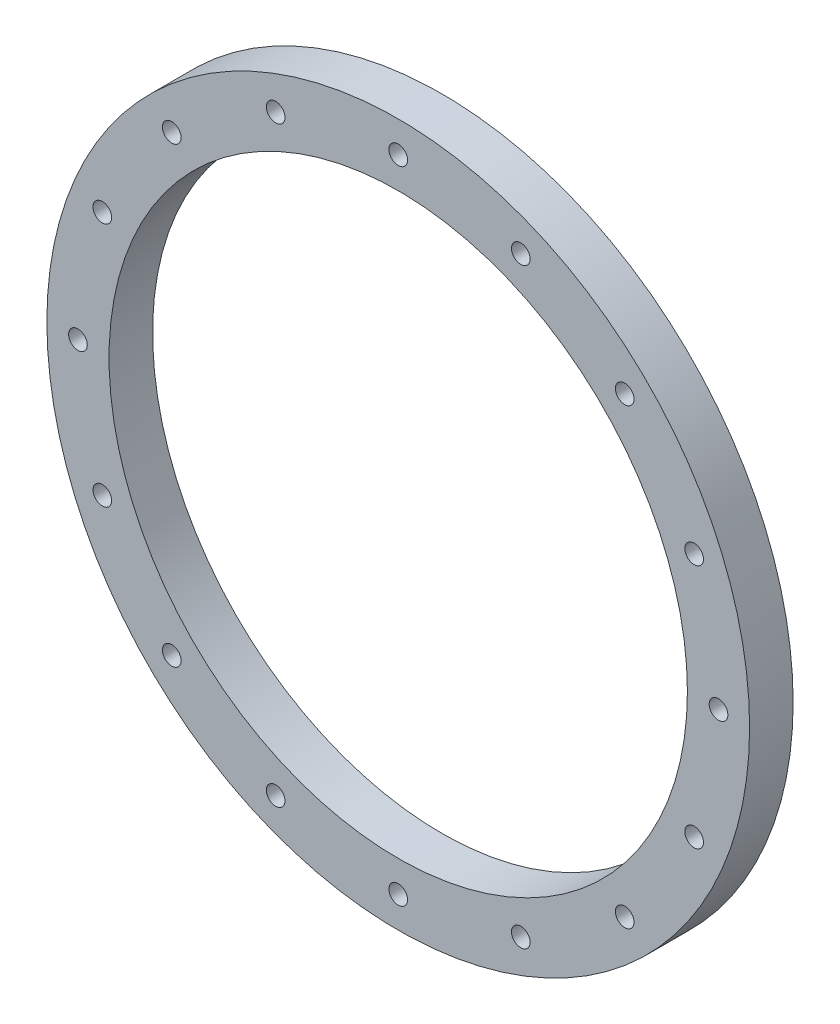
ISO-10303-21;
HEADER;
FILE_DESCRIPTION(('STEP AP214'),'2;1');
FILE_NAME('part.step','',(''),(''),'','','');
FILE_SCHEMA(('AUTOMOTIVE_DESIGN { 1 0 10303 214 1 1 1 1 }'));
ENDSEC;
DATA;
#1=APPLICATION_CONTEXT('core data for automotive mechanical design processes');
#2=APPLICATION_PROTOCOL_DEFINITION('international standard','automotive_design',2000,#1);
#3=PRODUCT_CONTEXT('',#1,'mechanical');
#4=PRODUCT('Part','Part','',(#3));
#5=PRODUCT_RELATED_PRODUCT_CATEGORY('part','',(#4));
#6=PRODUCT_DEFINITION_FORMATION('','',#4);
#7=PRODUCT_DEFINITION_CONTEXT('part definition',#1,'design');
#8=PRODUCT_DEFINITION('design','',#6,#7);
#9=PRODUCT_DEFINITION_SHAPE('','',#8);
#10=(LENGTH_UNIT() NAMED_UNIT(*) SI_UNIT(.MILLI.,.METRE.));
#11=(NAMED_UNIT(*) PLANE_ANGLE_UNIT() SI_UNIT($,.RADIAN.));
#12=(NAMED_UNIT(*) SI_UNIT($,.STERADIAN.) SOLID_ANGLE_UNIT());
#13=UNCERTAINTY_MEASURE_WITH_UNIT(LENGTH_MEASURE(1.E-05),#10,'distance_accuracy_value','');
#14=(GEOMETRIC_REPRESENTATION_CONTEXT(3) GLOBAL_UNCERTAINTY_ASSIGNED_CONTEXT((#13)) GLOBAL_UNIT_ASSIGNED_CONTEXT((#10,
#11,#12)) REPRESENTATION_CONTEXT('',''));
#15=CARTESIAN_POINT('',(0.,0.,0.));
#16=DIRECTION('',(0.,0.,1.));
#17=DIRECTION('',(1.,0.,0.));
#18=AXIS2_PLACEMENT_3D('',#15,#16,#17);
#19=CARTESIAN_POINT('',(0.,0.,70.));
#20=DIRECTION('',(0.,0.,1.));
#21=DIRECTION('',(1.,0.,0.));
#22=AXIS2_PLACEMENT_3D('',#19,#20,#21);
#23=PLANE('',#22);
#24=CARTESIAN_POINT('',(364.135243573728,364.135243573733,70.));
#25=DIRECTION('',(0.,0.,1.));
#26=DIRECTION('',(1.,0.,0.));
#27=AXIS2_PLACEMENT_3D('',#24,#25,#26);
#28=CIRCLE('',#27,15.);
#29=CARTESIAN_POINT('',(379.135243573728,364.135243573733,70.));
#30=VERTEX_POINT('',#29);
#31=EDGE_CURVE('E47',#30,#30,#28,.T.);
#32=ORIENTED_EDGE('',*,*,#31,.F.);
#33=EDGE_LOOP('',(#32));
#34=FACE_BOUND('',#33,.T.);
#35=CARTESIAN_POINT('',(475.765623459674,197.068573747892,70.));
#36=DIRECTION('',(0.,0.,1.));
#37=DIRECTION('',(1.,0.,0.));
#38=AXIS2_PLACEMENT_3D('',#35,#36,#37);
#39=CIRCLE('',#38,15.);
#40=CARTESIAN_POINT('',(490.765623459674,197.068573747892,70.));
#41=VERTEX_POINT('',#40);
#42=EDGE_CURVE('E52',#41,#41,#39,.T.);
#43=ORIENTED_EDGE('',*,*,#42,.F.);
#44=EDGE_LOOP('',(#43));
#45=FACE_BOUND('',#44,.T.);
#46=CARTESIAN_POINT('',(514.965,3.32003508423193E-12,70.));
#47=DIRECTION('',(0.,0.,1.));
#48=DIRECTION('',(1.,0.,0.));
#49=AXIS2_PLACEMENT_3D('',#46,#47,#48);
#50=CIRCLE('',#49,15.0000000000001);
#51=CARTESIAN_POINT('',(529.965,3.32003508423193E-12,70.));
#52=VERTEX_POINT('',#51);
#53=EDGE_CURVE('E55',#52,#52,#50,.T.);
#54=ORIENTED_EDGE('',*,*,#53,.F.);
#55=EDGE_LOOP('',(#54));
#56=FACE_BOUND('',#55,.T.);
#57=CARTESIAN_POINT('',(475.765623459676,-197.068573747885,70.));
#58=DIRECTION('',(0.,0.,1.));
#59=DIRECTION('',(1.,0.,0.));
#60=AXIS2_PLACEMENT_3D('',#57,#58,#59);
#61=CIRCLE('',#60,15.);
#62=CARTESIAN_POINT('',(490.765623459676,-197.068573747885,70.));
#63=VERTEX_POINT('',#62);
#64=EDGE_CURVE('E58',#63,#63,#61,.T.);
#65=ORIENTED_EDGE('',*,*,#64,.F.);
#66=EDGE_LOOP('',(#65));
#67=FACE_BOUND('',#66,.T.);
#68=CARTESIAN_POINT('',(364.135243573733,-364.135243573728,70.));
#69=DIRECTION('',(0.,0.,1.));
#70=DIRECTION('',(1.,0.,0.));
#71=AXIS2_PLACEMENT_3D('',#68,#69,#70);
#72=CIRCLE('',#71,15.0000000000001);
#73=CARTESIAN_POINT('',(379.135243573733,-364.135243573728,70.));
#74=VERTEX_POINT('',#73);
#75=EDGE_CURVE('E61',#74,#74,#72,.T.);
#76=ORIENTED_EDGE('',*,*,#75,.F.);
#77=EDGE_LOOP('',(#76));
#78=FACE_BOUND('',#77,.T.);
#79=CARTESIAN_POINT('',(197.068573747892,-475.765623459674,70.));
#80=DIRECTION('',(0.,0.,1.));
#81=DIRECTION('',(1.,0.,0.));
#82=AXIS2_PLACEMENT_3D('',#79,#80,#81);
#83=CIRCLE('',#82,15.);
#84=CARTESIAN_POINT('',(212.068573747892,-475.765623459674,70.));
#85=VERTEX_POINT('',#84);
#86=EDGE_CURVE('E64',#85,#85,#83,.T.);
#87=ORIENTED_EDGE('',*,*,#86,.F.);
#88=EDGE_LOOP('',(#87));
#89=FACE_BOUND('',#88,.T.);
#90=CARTESIAN_POINT('',(3.34454686168328E-12,-514.965,70.));
#91=DIRECTION('',(0.,0.,1.));
#92=DIRECTION('',(1.,0.,0.));
#93=AXIS2_PLACEMENT_3D('',#90,#91,#92);
#94=CIRCLE('',#93,15.);
#95=CARTESIAN_POINT('',(15.0000000000034,-514.965,70.));
#96=VERTEX_POINT('',#95);
#97=EDGE_CURVE('E67',#96,#96,#94,.T.);
#98=ORIENTED_EDGE('',*,*,#97,.F.);
#99=EDGE_LOOP('',(#98));
#100=FACE_BOUND('',#99,.T.);
#101=CARTESIAN_POINT('',(-197.068573747885,-475.765623459676,70.));
#102=DIRECTION('',(0.,0.,1.));
#103=DIRECTION('',(1.,0.,0.));
#104=AXIS2_PLACEMENT_3D('',#101,#102,#103);
#105=CIRCLE('',#104,15.);
#106=CARTESIAN_POINT('',(-182.068573747885,-475.765623459676,70.));
#107=VERTEX_POINT('',#106);
#108=EDGE_CURVE('E70',#107,#107,#105,.T.);
#109=ORIENTED_EDGE('',*,*,#108,.F.);
#110=EDGE_LOOP('',(#109));
#111=FACE_BOUND('',#110,.T.);
#112=CARTESIAN_POINT('',(-364.135243573728,-364.135243573733,70.));
#113=DIRECTION('',(0.,0.,1.));
#114=DIRECTION('',(1.,0.,0.));
#115=AXIS2_PLACEMENT_3D('',#112,#113,#114);
#116=CIRCLE('',#115,15.);
#117=CARTESIAN_POINT('',(-349.135243573728,-364.135243573733,70.));
#118=VERTEX_POINT('',#117);
#119=EDGE_CURVE('E73',#118,#118,#116,.T.);
#120=ORIENTED_EDGE('',*,*,#119,.F.);
#121=EDGE_LOOP('',(#120));
#122=FACE_BOUND('',#121,.T.);
#123=CARTESIAN_POINT('',(-475.765623459674,-197.068573747892,70.));
#124=DIRECTION('',(0.,0.,1.));
#125=DIRECTION('',(1.,0.,0.));
#126=AXIS2_PLACEMENT_3D('',#123,#124,#125);
#127=CIRCLE('',#126,15.);
#128=CARTESIAN_POINT('',(-460.765623459673,-197.068573747892,70.));
#129=VERTEX_POINT('',#128);
#130=EDGE_CURVE('E76',#129,#129,#127,.T.);
#131=ORIENTED_EDGE('',*,*,#130,.F.);
#132=EDGE_LOOP('',(#131));
#133=FACE_BOUND('',#132,.T.);
#134=CARTESIAN_POINT('',(-514.965,-3.62904151174348E-12,70.));
#135=DIRECTION('',(0.,0.,1.));
#136=DIRECTION('',(1.,0.,0.));
#137=AXIS2_PLACEMENT_3D('',#134,#135,#136);
#138=CIRCLE('',#137,15.);
#139=CARTESIAN_POINT('',(-499.965,-3.62904151174348E-12,70.));
#140=VERTEX_POINT('',#139);
#141=EDGE_CURVE('E79',#140,#140,#138,.T.);
#142=ORIENTED_EDGE('',*,*,#141,.F.);
#143=EDGE_LOOP('',(#142));
#144=FACE_BOUND('',#143,.T.);
#145=CARTESIAN_POINT('',(-475.765623459676,197.068573747885,70.));
#146=DIRECTION('',(0.,0.,1.));
#147=DIRECTION('',(1.,0.,0.));
#148=AXIS2_PLACEMENT_3D('',#145,#146,#147);
#149=CIRCLE('',#148,15.);
#150=CARTESIAN_POINT('',(-460.765623459676,197.068573747885,70.));
#151=VERTEX_POINT('',#150);
#152=EDGE_CURVE('E82',#151,#151,#149,.T.);
#153=ORIENTED_EDGE('',*,*,#152,.F.);
#154=EDGE_LOOP('',(#153));
#155=FACE_BOUND('',#154,.T.);
#156=CARTESIAN_POINT('',(-364.135243573733,364.135243573728,70.));
#157=DIRECTION('',(0.,0.,1.));
#158=DIRECTION('',(1.,0.,0.));
#159=AXIS2_PLACEMENT_3D('',#156,#157,#158);
#160=CIRCLE('',#159,15.0000000000001);
#161=CARTESIAN_POINT('',(-349.135243573733,364.135243573728,70.));
#162=VERTEX_POINT('',#161);
#163=EDGE_CURVE('E85',#162,#162,#160,.T.);
#164=ORIENTED_EDGE('',*,*,#163,.F.);
#165=EDGE_LOOP('',(#164));
#166=FACE_BOUND('',#165,.T.);
#167=CARTESIAN_POINT('',(-197.068573747892,475.765623459674,70.));
#168=DIRECTION('',(0.,0.,1.));
#169=DIRECTION('',(1.,0.,0.));
#170=AXIS2_PLACEMENT_3D('',#167,#168,#169);
#171=CIRCLE('',#170,15.);
#172=CARTESIAN_POINT('',(-182.068573747892,475.765623459674,70.));
#173=VERTEX_POINT('',#172);
#174=EDGE_CURVE('E88',#173,#173,#171,.T.);
#175=ORIENTED_EDGE('',*,*,#174,.F.);
#176=EDGE_LOOP('',(#175));
#177=FACE_BOUND('',#176,.T.);
#178=CARTESIAN_POINT('',(-3.18495230189342E-12,514.965,70.));
#179=DIRECTION('',(0.,0.,1.));
#180=DIRECTION('',(1.,0.,0.));
#181=AXIS2_PLACEMENT_3D('',#178,#179,#180);
#182=CIRCLE('',#181,15.);
#183=CARTESIAN_POINT('',(14.9999999999968,514.965,70.));
#184=VERTEX_POINT('',#183);
#185=EDGE_CURVE('E91',#184,#184,#182,.T.);
#186=ORIENTED_EDGE('',*,*,#185,.F.);
#187=EDGE_LOOP('',(#186));
#188=FACE_BOUND('',#187,.T.);
#189=CARTESIAN_POINT('',(197.068573747885,475.765623459676,70.));
#190=DIRECTION('',(0.,0.,1.));
#191=DIRECTION('',(1.,0.,0.));
#192=AXIS2_PLACEMENT_3D('',#189,#190,#191);
#193=CIRCLE('',#192,15.0000000000001);
#194=CARTESIAN_POINT('',(212.068573747885,475.765623459676,70.));
#195=VERTEX_POINT('',#194);
#196=EDGE_CURVE('E94',#195,#195,#193,.T.);
#197=ORIENTED_EDGE('',*,*,#196,.F.);
#198=EDGE_LOOP('',(#197));
#199=FACE_BOUND('',#198,.T.);
#200=CARTESIAN_POINT('',(0.,0.,70.));
#201=DIRECTION('',(0.,0.,1.));
#202=DIRECTION('',(1.,0.,0.));
#203=AXIS2_PLACEMENT_3D('',#200,#201,#202);
#204=CIRCLE('',#203,564.965);
#205=CARTESIAN_POINT('',(564.965,0.,70.));
#206=VERTEX_POINT('',#205);
#207=EDGE_CURVE('E10',#206,#206,#204,.T.);
#208=ORIENTED_EDGE('',*,*,#207,.T.);
#209=EDGE_LOOP('',(#208));
#210=FACE_BOUND('',#209,.T.);
#211=CARTESIAN_POINT('',(0.,0.,70.));
#212=DIRECTION('',(0.,0.,1.));
#213=DIRECTION('',(1.,0.,0.));
#214=AXIS2_PLACEMENT_3D('',#211,#212,#213);
#215=CIRCLE('',#214,464.965);
#216=CARTESIAN_POINT('',(464.965,0.,70.));
#217=VERTEX_POINT('',#216);
#218=EDGE_CURVE('E42',#217,#217,#215,.T.);
#219=ORIENTED_EDGE('',*,*,#218,.F.);
#220=EDGE_LOOP('',(#219));
#221=FACE_BOUND('',#220,.T.);
#222=ADVANCED_FACE('F31',(#34,#45,#56,#67,#78,#89,#100,#111,#122,#133,#144,#155,#166,#177,#188,
#199,#210,#221),#23,.T.);
#223=CARTESIAN_POINT('',(0.,0.,0.));
#224=DIRECTION('',(0.,0.,1.));
#225=DIRECTION('',(1.,0.,0.));
#226=AXIS2_PLACEMENT_3D('',#223,#224,#225);
#227=PLANE('',#226);
#228=CARTESIAN_POINT('',(364.135243573728,364.135243573733,0.));
#229=DIRECTION('',(0.,0.,1.));
#230=DIRECTION('',(1.,0.,0.));
#231=AXIS2_PLACEMENT_3D('',#228,#229,#230);
#232=CIRCLE('',#231,15.);
#233=CARTESIAN_POINT('',(379.135243573728,364.135243573733,0.));
#234=VERTEX_POINT('',#233);
#235=EDGE_CURVE('E100',#234,#234,#232,.T.);
#236=ORIENTED_EDGE('',*,*,#235,.T.);
#237=EDGE_LOOP('',(#236));
#238=FACE_BOUND('',#237,.T.);
#239=CARTESIAN_POINT('',(475.765623459674,197.068573747892,0.));
#240=DIRECTION('',(0.,0.,1.));
#241=DIRECTION('',(1.,0.,0.));
#242=AXIS2_PLACEMENT_3D('',#239,#240,#241);
#243=CIRCLE('',#242,15.);
#244=CARTESIAN_POINT('',(490.765623459674,197.068573747892,0.));
#245=VERTEX_POINT('',#244);
#246=EDGE_CURVE('E120',#245,#245,#243,.T.);
#247=ORIENTED_EDGE('',*,*,#246,.T.);
#248=EDGE_LOOP('',(#247));
#249=FACE_BOUND('',#248,.T.);
#250=CARTESIAN_POINT('',(514.965,3.32003508423193E-12,0.));
#251=DIRECTION('',(0.,0.,1.));
#252=DIRECTION('',(1.,0.,0.));
#253=AXIS2_PLACEMENT_3D('',#250,#251,#252);
#254=CIRCLE('',#253,15.0000000000001);
#255=CARTESIAN_POINT('',(529.965,3.32003508423193E-12,0.));
#256=VERTEX_POINT('',#255);
#257=EDGE_CURVE('E117',#256,#256,#254,.T.);
#258=ORIENTED_EDGE('',*,*,#257,.T.);
#259=EDGE_LOOP('',(#258));
#260=FACE_BOUND('',#259,.T.);
#261=CARTESIAN_POINT('',(475.765623459676,-197.068573747885,0.));
#262=DIRECTION('',(0.,0.,1.));
#263=DIRECTION('',(1.,0.,0.));
#264=AXIS2_PLACEMENT_3D('',#261,#262,#263);
#265=CIRCLE('',#264,15.);
#266=CARTESIAN_POINT('',(490.765623459676,-197.068573747885,0.));
#267=VERTEX_POINT('',#266);
#268=EDGE_CURVE('E114',#267,#267,#265,.T.);
#269=ORIENTED_EDGE('',*,*,#268,.T.);
#270=EDGE_LOOP('',(#269));
#271=FACE_BOUND('',#270,.T.);
#272=CARTESIAN_POINT('',(364.135243573733,-364.135243573728,0.));
#273=DIRECTION('',(0.,0.,1.));
#274=DIRECTION('',(1.,0.,0.));
#275=AXIS2_PLACEMENT_3D('',#272,#273,#274);
#276=CIRCLE('',#275,15.0000000000001);
#277=CARTESIAN_POINT('',(379.135243573733,-364.135243573728,0.));
#278=VERTEX_POINT('',#277);
#279=EDGE_CURVE('E111',#278,#278,#276,.T.);
#280=ORIENTED_EDGE('',*,*,#279,.T.);
#281=EDGE_LOOP('',(#280));
#282=FACE_BOUND('',#281,.T.);
#283=CARTESIAN_POINT('',(197.068573747892,-475.765623459674,0.));
#284=DIRECTION('',(0.,0.,1.));
#285=DIRECTION('',(1.,0.,0.));
#286=AXIS2_PLACEMENT_3D('',#283,#284,#285);
#287=CIRCLE('',#286,15.);
#288=CARTESIAN_POINT('',(212.068573747892,-475.765623459674,0.));
#289=VERTEX_POINT('',#288);
#290=EDGE_CURVE('E108',#289,#289,#287,.T.);
#291=ORIENTED_EDGE('',*,*,#290,.T.);
#292=EDGE_LOOP('',(#291));
#293=FACE_BOUND('',#292,.T.);
#294=CARTESIAN_POINT('',(3.34454686168328E-12,-514.965,0.));
#295=DIRECTION('',(0.,0.,1.));
#296=DIRECTION('',(1.,0.,0.));
#297=AXIS2_PLACEMENT_3D('',#294,#295,#296);
#298=CIRCLE('',#297,15.);
#299=CARTESIAN_POINT('',(15.0000000000034,-514.965,0.));
#300=VERTEX_POINT('',#299);
#301=EDGE_CURVE('E104',#300,#300,#298,.T.);
#302=ORIENTED_EDGE('',*,*,#301,.T.);
#303=EDGE_LOOP('',(#302));
#304=FACE_BOUND('',#303,.T.);
#305=CARTESIAN_POINT('',(-197.068573747885,-475.765623459676,0.));
#306=DIRECTION('',(0.,0.,1.));
#307=DIRECTION('',(1.,0.,0.));
#308=AXIS2_PLACEMENT_3D('',#305,#306,#307);
#309=CIRCLE('',#308,15.);
#310=CARTESIAN_POINT('',(-182.068573747885,-475.765623459676,0.));
#311=VERTEX_POINT('',#310);
#312=EDGE_CURVE('E101',#311,#311,#309,.T.);
#313=ORIENTED_EDGE('',*,*,#312,.T.);
#314=EDGE_LOOP('',(#313));
#315=FACE_BOUND('',#314,.T.);
#316=CARTESIAN_POINT('',(-364.135243573728,-364.135243573733,0.));
#317=DIRECTION('',(0.,0.,1.));
#318=DIRECTION('',(1.,0.,0.));
#319=AXIS2_PLACEMENT_3D('',#316,#317,#318);
#320=CIRCLE('',#319,15.);
#321=CARTESIAN_POINT('',(-349.135243573728,-364.135243573733,0.));
#322=VERTEX_POINT('',#321);
#323=EDGE_CURVE('E105',#322,#322,#320,.T.);
#324=ORIENTED_EDGE('',*,*,#323,.T.);
#325=EDGE_LOOP('',(#324));
#326=FACE_BOUND('',#325,.T.);
#327=CARTESIAN_POINT('',(-475.765623459674,-197.068573747892,0.));
#328=DIRECTION('',(0.,0.,1.));
#329=DIRECTION('',(1.,0.,0.));
#330=AXIS2_PLACEMENT_3D('',#327,#328,#329);
#331=CIRCLE('',#330,15.);
#332=CARTESIAN_POINT('',(-460.765623459673,-197.068573747892,0.));
#333=VERTEX_POINT('',#332);
#334=EDGE_CURVE('E140',#333,#333,#331,.T.);
#335=ORIENTED_EDGE('',*,*,#334,.T.);
#336=EDGE_LOOP('',(#335));
#337=FACE_BOUND('',#336,.T.);
#338=CARTESIAN_POINT('',(-514.965,-3.62904151174348E-12,0.));
#339=DIRECTION('',(0.,0.,1.));
#340=DIRECTION('',(1.,0.,0.));
#341=AXIS2_PLACEMENT_3D('',#338,#339,#340);
#342=CIRCLE('',#341,15.);
#343=CARTESIAN_POINT('',(-499.965,-3.62904151174348E-12,0.));
#344=VERTEX_POINT('',#343);
#345=EDGE_CURVE('E137',#344,#344,#342,.T.);
#346=ORIENTED_EDGE('',*,*,#345,.T.);
#347=EDGE_LOOP('',(#346));
#348=FACE_BOUND('',#347,.T.);
#349=CARTESIAN_POINT('',(-475.765623459676,197.068573747885,0.));
#350=DIRECTION('',(0.,0.,1.));
#351=DIRECTION('',(1.,0.,0.));
#352=AXIS2_PLACEMENT_3D('',#349,#350,#351);
#353=CIRCLE('',#352,15.);
#354=CARTESIAN_POINT('',(-460.765623459676,197.068573747885,0.));
#355=VERTEX_POINT('',#354);
#356=EDGE_CURVE('E134',#355,#355,#353,.T.);
#357=ORIENTED_EDGE('',*,*,#356,.T.);
#358=EDGE_LOOP('',(#357));
#359=FACE_BOUND('',#358,.T.);
#360=CARTESIAN_POINT('',(-364.135243573733,364.135243573728,0.));
#361=DIRECTION('',(0.,0.,1.));
#362=DIRECTION('',(1.,0.,0.));
#363=AXIS2_PLACEMENT_3D('',#360,#361,#362);
#364=CIRCLE('',#363,15.0000000000001);
#365=CARTESIAN_POINT('',(-349.135243573733,364.135243573728,0.));
#366=VERTEX_POINT('',#365);
#367=EDGE_CURVE('E131',#366,#366,#364,.T.);
#368=ORIENTED_EDGE('',*,*,#367,.T.);
#369=EDGE_LOOP('',(#368));
#370=FACE_BOUND('',#369,.T.);
#371=CARTESIAN_POINT('',(-197.068573747892,475.765623459674,0.));
#372=DIRECTION('',(0.,0.,1.));
#373=DIRECTION('',(1.,0.,0.));
#374=AXIS2_PLACEMENT_3D('',#371,#372,#373);
#375=CIRCLE('',#374,15.);
#376=CARTESIAN_POINT('',(-182.068573747892,475.765623459674,0.));
#377=VERTEX_POINT('',#376);
#378=EDGE_CURVE('E128',#377,#377,#375,.T.);
#379=ORIENTED_EDGE('',*,*,#378,.T.);
#380=EDGE_LOOP('',(#379));
#381=FACE_BOUND('',#380,.T.);
#382=CARTESIAN_POINT('',(-3.18495230189342E-12,514.965,0.));
#383=DIRECTION('',(0.,0.,1.));
#384=DIRECTION('',(1.,0.,0.));
#385=AXIS2_PLACEMENT_3D('',#382,#383,#384);
#386=CIRCLE('',#385,15.);
#387=CARTESIAN_POINT('',(14.9999999999968,514.965,0.));
#388=VERTEX_POINT('',#387);
#389=EDGE_CURVE('E125',#388,#388,#386,.T.);
#390=ORIENTED_EDGE('',*,*,#389,.T.);
#391=EDGE_LOOP('',(#390));
#392=FACE_BOUND('',#391,.T.);
#393=CARTESIAN_POINT('',(197.068573747885,475.765623459676,0.));
#394=DIRECTION('',(0.,0.,1.));
#395=DIRECTION('',(1.,0.,0.));
#396=AXIS2_PLACEMENT_3D('',#393,#394,#395);
#397=CIRCLE('',#396,15.0000000000001);
#398=CARTESIAN_POINT('',(212.068573747885,475.765623459676,0.));
#399=VERTEX_POINT('',#398);
#400=EDGE_CURVE('E97',#399,#399,#397,.T.);
#401=ORIENTED_EDGE('',*,*,#400,.T.);
#402=EDGE_LOOP('',(#401));
#403=FACE_BOUND('',#402,.T.);
#404=CARTESIAN_POINT('',(0.,0.,0.));
#405=DIRECTION('',(0.,0.,1.));
#406=DIRECTION('',(1.,0.,0.));
#407=AXIS2_PLACEMENT_3D('',#404,#405,#406);
#408=CIRCLE('',#407,564.965);
#409=CARTESIAN_POINT('',(564.965,0.,0.));
#410=VERTEX_POINT('',#409);
#411=EDGE_CURVE('E35',#410,#410,#408,.T.);
#412=ORIENTED_EDGE('',*,*,#411,.F.);
#413=EDGE_LOOP('',(#412));
#414=FACE_BOUND('',#413,.T.);
#415=CARTESIAN_POINT('',(0.,0.,0.));
#416=DIRECTION('',(0.,0.,1.));
#417=DIRECTION('',(1.,0.,0.));
#418=AXIS2_PLACEMENT_3D('',#415,#416,#417);
#419=CIRCLE('',#418,464.965);
#420=CARTESIAN_POINT('',(464.965,0.,0.));
#421=VERTEX_POINT('',#420);
#422=EDGE_CURVE('E44',#421,#421,#419,.T.);
#423=ORIENTED_EDGE('',*,*,#422,.T.);
#424=EDGE_LOOP('',(#423));
#425=FACE_BOUND('',#424,.T.);
#426=ADVANCED_FACE('F146',(#238,#249,#260,#271,#282,#293,#304,#315,#326,#337,#348,#359,#370,
#381,#392,#403,#414,#425),#227,.F.);
#427=CARTESIAN_POINT('',(0.,0.,70.));
#428=DIRECTION('',(0.,0.,-1.));
#429=DIRECTION('',(-1.,0.,0.));
#430=AXIS2_PLACEMENT_3D('',#427,#428,#429);
#431=CYLINDRICAL_SURFACE('',#430,564.965);
#432=ORIENTED_EDGE('',*,*,#207,.F.);
#433=EDGE_LOOP('',(#432));
#434=FACE_BOUND('',#433,.T.);
#435=ORIENTED_EDGE('',*,*,#411,.T.);
#436=EDGE_LOOP('',(#435));
#437=FACE_BOUND('',#436,.T.);
#438=ADVANCED_FACE('F33',(#434,#437),#431,.T.);
#439=CARTESIAN_POINT('',(0.,0.,70.));
#440=DIRECTION('',(0.,0.,-1.));
#441=DIRECTION('',(-1.,0.,0.));
#442=AXIS2_PLACEMENT_3D('',#439,#440,#441);
#443=CYLINDRICAL_SURFACE('',#442,464.965);
#444=ORIENTED_EDGE('',*,*,#218,.T.);
#445=EDGE_LOOP('',(#444));
#446=FACE_BOUND('',#445,.T.);
#447=ORIENTED_EDGE('',*,*,#422,.F.);
#448=EDGE_LOOP('',(#447));
#449=FACE_BOUND('',#448,.T.);
#450=ADVANCED_FACE('F175',(#446,#449),#443,.F.);
#451=CARTESIAN_POINT('',(197.068573747885,475.765623459676,0.));
#452=DIRECTION('',(0.,0.,1.));
#453=DIRECTION('',(1.,0.,0.));
#454=AXIS2_PLACEMENT_3D('',#451,#452,#453);
#455=CYLINDRICAL_SURFACE('',#454,15.0000000000001);
#456=ORIENTED_EDGE('',*,*,#196,.T.);
#457=EDGE_LOOP('',(#456));
#458=FACE_BOUND('',#457,.T.);
#459=ORIENTED_EDGE('',*,*,#400,.F.);
#460=EDGE_LOOP('',(#459));
#461=FACE_BOUND('',#460,.T.);
#462=ADVANCED_FACE('F178',(#458,#461),#455,.F.);
#463=CARTESIAN_POINT('',(-3.18495230189342E-12,514.965,0.));
#464=DIRECTION('',(0.,0.,1.));
#465=DIRECTION('',(1.,0.,0.));
#466=AXIS2_PLACEMENT_3D('',#463,#464,#465);
#467=CYLINDRICAL_SURFACE('',#466,15.);
#468=ORIENTED_EDGE('',*,*,#185,.T.);
#469=EDGE_LOOP('',(#468));
#470=FACE_BOUND('',#469,.T.);
#471=ORIENTED_EDGE('',*,*,#389,.F.);
#472=EDGE_LOOP('',(#471));
#473=FACE_BOUND('',#472,.T.);
#474=ADVANCED_FACE('F181',(#470,#473),#467,.F.);
#475=CARTESIAN_POINT('',(-197.068573747892,475.765623459674,0.));
#476=DIRECTION('',(0.,0.,1.));
#477=DIRECTION('',(1.,0.,0.));
#478=AXIS2_PLACEMENT_3D('',#475,#476,#477);
#479=CYLINDRICAL_SURFACE('',#478,15.);
#480=ORIENTED_EDGE('',*,*,#174,.T.);
#481=EDGE_LOOP('',(#480));
#482=FACE_BOUND('',#481,.T.);
#483=ORIENTED_EDGE('',*,*,#378,.F.);
#484=EDGE_LOOP('',(#483));
#485=FACE_BOUND('',#484,.T.);
#486=ADVANCED_FACE('F213',(#482,#485),#479,.F.);
#487=CARTESIAN_POINT('',(-364.135243573733,364.135243573728,0.));
#488=DIRECTION('',(0.,0.,1.));
#489=DIRECTION('',(1.,0.,0.));
#490=AXIS2_PLACEMENT_3D('',#487,#488,#489);
#491=CYLINDRICAL_SURFACE('',#490,15.0000000000001);
#492=ORIENTED_EDGE('',*,*,#163,.T.);
#493=EDGE_LOOP('',(#492));
#494=FACE_BOUND('',#493,.T.);
#495=ORIENTED_EDGE('',*,*,#367,.F.);
#496=EDGE_LOOP('',(#495));
#497=FACE_BOUND('',#496,.T.);
#498=ADVANCED_FACE('F217',(#494,#497),#491,.F.);
#499=CARTESIAN_POINT('',(-475.765623459676,197.068573747885,0.));
#500=DIRECTION('',(0.,0.,1.));
#501=DIRECTION('',(1.,0.,0.));
#502=AXIS2_PLACEMENT_3D('',#499,#500,#501);
#503=CYLINDRICAL_SURFACE('',#502,15.);
#504=ORIENTED_EDGE('',*,*,#152,.T.);
#505=EDGE_LOOP('',(#504));
#506=FACE_BOUND('',#505,.T.);
#507=ORIENTED_EDGE('',*,*,#356,.F.);
#508=EDGE_LOOP('',(#507));
#509=FACE_BOUND('',#508,.T.);
#510=ADVANCED_FACE('F221',(#506,#509),#503,.F.);
#511=CARTESIAN_POINT('',(-514.965,-3.62904151174348E-12,0.));
#512=DIRECTION('',(0.,0.,1.));
#513=DIRECTION('',(1.,0.,0.));
#514=AXIS2_PLACEMENT_3D('',#511,#512,#513);
#515=CYLINDRICAL_SURFACE('',#514,15.);
#516=ORIENTED_EDGE('',*,*,#141,.T.);
#517=EDGE_LOOP('',(#516));
#518=FACE_BOUND('',#517,.T.);
#519=ORIENTED_EDGE('',*,*,#345,.F.);
#520=EDGE_LOOP('',(#519));
#521=FACE_BOUND('',#520,.T.);
#522=ADVANCED_FACE('F162',(#518,#521),#515,.F.);
#523=CARTESIAN_POINT('',(-475.765623459674,-197.068573747892,0.));
#524=DIRECTION('',(0.,0.,1.));
#525=DIRECTION('',(1.,0.,0.));
#526=AXIS2_PLACEMENT_3D('',#523,#524,#525);
#527=CYLINDRICAL_SURFACE('',#526,15.);
#528=ORIENTED_EDGE('',*,*,#130,.T.);
#529=EDGE_LOOP('',(#528));
#530=FACE_BOUND('',#529,.T.);
#531=ORIENTED_EDGE('',*,*,#334,.F.);
#532=EDGE_LOOP('',(#531));
#533=FACE_BOUND('',#532,.T.);
#534=ADVANCED_FACE('F152',(#530,#533),#527,.F.);
#535=CARTESIAN_POINT('',(-364.135243573728,-364.135243573733,0.));
#536=DIRECTION('',(0.,0.,1.));
#537=DIRECTION('',(1.,0.,0.));
#538=AXIS2_PLACEMENT_3D('',#535,#536,#537);
#539=CYLINDRICAL_SURFACE('',#538,15.);
#540=ORIENTED_EDGE('',*,*,#119,.T.);
#541=EDGE_LOOP('',(#540));
#542=FACE_BOUND('',#541,.T.);
#543=ORIENTED_EDGE('',*,*,#323,.F.);
#544=EDGE_LOOP('',(#543));
#545=FACE_BOUND('',#544,.T.);
#546=ADVANCED_FACE('F149',(#542,#545),#539,.F.);
#547=CARTESIAN_POINT('',(-197.068573747885,-475.765623459676,0.));
#548=DIRECTION('',(0.,0.,1.));
#549=DIRECTION('',(1.,0.,0.));
#550=AXIS2_PLACEMENT_3D('',#547,#548,#549);
#551=CYLINDRICAL_SURFACE('',#550,15.);
#552=ORIENTED_EDGE('',*,*,#108,.T.);
#553=EDGE_LOOP('',(#552));
#554=FACE_BOUND('',#553,.T.);
#555=ORIENTED_EDGE('',*,*,#312,.F.);
#556=EDGE_LOOP('',(#555));
#557=FACE_BOUND('',#556,.T.);
#558=ADVANCED_FACE('F151',(#554,#557),#551,.F.);
#559=CARTESIAN_POINT('',(3.34454686168328E-12,-514.965,0.));
#560=DIRECTION('',(0.,0.,1.));
#561=DIRECTION('',(1.,0.,0.));
#562=AXIS2_PLACEMENT_3D('',#559,#560,#561);
#563=CYLINDRICAL_SURFACE('',#562,15.);
#564=ORIENTED_EDGE('',*,*,#97,.T.);
#565=EDGE_LOOP('',(#564));
#566=FACE_BOUND('',#565,.T.);
#567=ORIENTED_EDGE('',*,*,#301,.F.);
#568=EDGE_LOOP('',(#567));
#569=FACE_BOUND('',#568,.T.);
#570=ADVANCED_FACE('F159',(#566,#569),#563,.F.);
#571=CARTESIAN_POINT('',(197.068573747892,-475.765623459674,0.));
#572=DIRECTION('',(0.,0.,1.));
#573=DIRECTION('',(1.,0.,0.));
#574=AXIS2_PLACEMENT_3D('',#571,#572,#573);
#575=CYLINDRICAL_SURFACE('',#574,15.);
#576=ORIENTED_EDGE('',*,*,#86,.T.);
#577=EDGE_LOOP('',(#576));
#578=FACE_BOUND('',#577,.T.);
#579=ORIENTED_EDGE('',*,*,#290,.F.);
#580=EDGE_LOOP('',(#579));
#581=FACE_BOUND('',#580,.T.);
#582=ADVANCED_FACE('F186',(#578,#581),#575,.F.);
#583=CARTESIAN_POINT('',(364.135243573733,-364.135243573728,0.));
#584=DIRECTION('',(0.,0.,1.));
#585=DIRECTION('',(1.,0.,0.));
#586=AXIS2_PLACEMENT_3D('',#583,#584,#585);
#587=CYLINDRICAL_SURFACE('',#586,15.0000000000001);
#588=ORIENTED_EDGE('',*,*,#75,.T.);
#589=EDGE_LOOP('',(#588));
#590=FACE_BOUND('',#589,.T.);
#591=ORIENTED_EDGE('',*,*,#279,.F.);
#592=EDGE_LOOP('',(#591));
#593=FACE_BOUND('',#592,.T.);
#594=ADVANCED_FACE('F190',(#590,#593),#587,.F.);
#595=CARTESIAN_POINT('',(475.765623459676,-197.068573747885,0.));
#596=DIRECTION('',(0.,0.,1.));
#597=DIRECTION('',(1.,0.,0.));
#598=AXIS2_PLACEMENT_3D('',#595,#596,#597);
#599=CYLINDRICAL_SURFACE('',#598,15.);
#600=ORIENTED_EDGE('',*,*,#64,.T.);
#601=EDGE_LOOP('',(#600));
#602=FACE_BOUND('',#601,.T.);
#603=ORIENTED_EDGE('',*,*,#268,.F.);
#604=EDGE_LOOP('',(#603));
#605=FACE_BOUND('',#604,.T.);
#606=ADVANCED_FACE('F194',(#602,#605),#599,.F.);
#607=CARTESIAN_POINT('',(514.965,3.32003508423193E-12,0.));
#608=DIRECTION('',(0.,0.,1.));
#609=DIRECTION('',(1.,0.,0.));
#610=AXIS2_PLACEMENT_3D('',#607,#608,#609);
#611=CYLINDRICAL_SURFACE('',#610,15.0000000000001);
#612=ORIENTED_EDGE('',*,*,#53,.T.);
#613=EDGE_LOOP('',(#612));
#614=FACE_BOUND('',#613,.T.);
#615=ORIENTED_EDGE('',*,*,#257,.F.);
#616=EDGE_LOOP('',(#615));
#617=FACE_BOUND('',#616,.T.);
#618=ADVANCED_FACE('F198',(#614,#617),#611,.F.);
#619=CARTESIAN_POINT('',(475.765623459674,197.068573747892,0.));
#620=DIRECTION('',(0.,0.,1.));
#621=DIRECTION('',(1.,0.,0.));
#622=AXIS2_PLACEMENT_3D('',#619,#620,#621);
#623=CYLINDRICAL_SURFACE('',#622,15.);
#624=ORIENTED_EDGE('',*,*,#42,.T.);
#625=EDGE_LOOP('',(#624));
#626=FACE_BOUND('',#625,.T.);
#627=ORIENTED_EDGE('',*,*,#246,.F.);
#628=EDGE_LOOP('',(#627));
#629=FACE_BOUND('',#628,.T.);
#630=ADVANCED_FACE('F202',(#626,#629),#623,.F.);
#631=CARTESIAN_POINT('',(364.135243573728,364.135243573733,0.));
#632=DIRECTION('',(0.,0.,1.));
#633=DIRECTION('',(1.,0.,0.));
#634=AXIS2_PLACEMENT_3D('',#631,#632,#633);
#635=CYLINDRICAL_SURFACE('',#634,15.);
#636=ORIENTED_EDGE('',*,*,#31,.T.);
#637=EDGE_LOOP('',(#636));
#638=FACE_BOUND('',#637,.T.);
#639=ORIENTED_EDGE('',*,*,#235,.F.);
#640=EDGE_LOOP('',(#639));
#641=FACE_BOUND('',#640,.T.);
#642=ADVANCED_FACE('F206',(#638,#641),#635,.F.);
#643=CLOSED_SHELL('',(#222,#426,#438,#450,#462,#474,#486,#498,#510,#522,#534,#546,#558,#570,
#582,#594,#606,#618,#630,#642));
#644=MANIFOLD_SOLID_BREP('B2',#643);
#645=ADVANCED_BREP_SHAPE_REPRESENTATION('',(#18,#644),#14);
#646=SHAPE_DEFINITION_REPRESENTATION(#9,#645);
ENDSEC;
END-ISO-10303-21;
